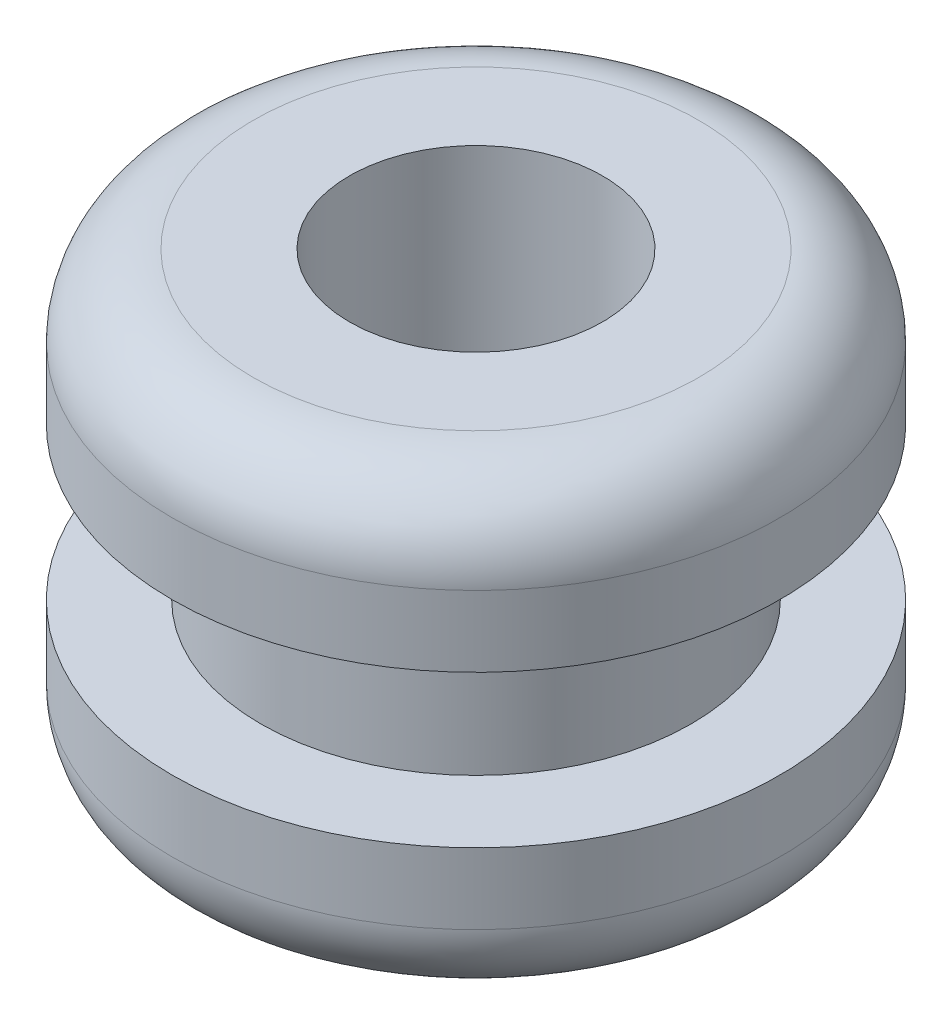
ISO-10303-21;
HEADER;
FILE_DESCRIPTION(('STEP AP214'),'2;1');
FILE_NAME('part.step','',(''),(''),'','','');
FILE_SCHEMA(('AUTOMOTIVE_DESIGN { 1 0 10303 214 1 1 1 1 }'));
ENDSEC;
DATA;
#1=APPLICATION_CONTEXT('core data for automotive mechanical design processes');
#2=APPLICATION_PROTOCOL_DEFINITION('international standard','automotive_design',2000,#1);
#3=PRODUCT_CONTEXT('',#1,'mechanical');
#4=PRODUCT('Part','Part','',(#3));
#5=PRODUCT_RELATED_PRODUCT_CATEGORY('part','',(#4));
#6=PRODUCT_DEFINITION_FORMATION('','',#4);
#7=PRODUCT_DEFINITION_CONTEXT('part definition',#1,'design');
#8=PRODUCT_DEFINITION('design','',#6,#7);
#9=PRODUCT_DEFINITION_SHAPE('','',#8);
#10=(LENGTH_UNIT() NAMED_UNIT(*) SI_UNIT(.MILLI.,.METRE.));
#11=(NAMED_UNIT(*) PLANE_ANGLE_UNIT() SI_UNIT($,.RADIAN.));
#12=(NAMED_UNIT(*) SI_UNIT($,.STERADIAN.) SOLID_ANGLE_UNIT());
#13=UNCERTAINTY_MEASURE_WITH_UNIT(LENGTH_MEASURE(1.E-05),#10,'distance_accuracy_value','');
#14=(GEOMETRIC_REPRESENTATION_CONTEXT(3) GLOBAL_UNCERTAINTY_ASSIGNED_CONTEXT((#13)) GLOBAL_UNIT_ASSIGNED_CONTEXT((#10,
#11,#12)) REPRESENTATION_CONTEXT('',''));
#15=CARTESIAN_POINT('',(0.,0.,0.));
#16=DIRECTION('',(0.,0.,1.));
#17=DIRECTION('',(1.,0.,0.));
#18=AXIS2_PLACEMENT_3D('',#15,#16,#17);
#19=CARTESIAN_POINT('',(0.,7.14375,0.));
#20=DIRECTION('',(0.,-1.,0.));
#21=DIRECTION('',(0.,0.,-1.));
#22=AXIS2_PLACEMENT_3D('',#19,#20,#21);
#23=CYLINDRICAL_SURFACE('',#22,9.525);
#24=CARTESIAN_POINT('',(0.,-4.60375,0.));
#25=DIRECTION('',(0.,1.,0.));
#26=DIRECTION('',(0.,0.,1.));
#27=AXIS2_PLACEMENT_3D('',#24,#25,#26);
#28=CIRCLE('',#27,9.525);
#29=CARTESIAN_POINT('',(0.,-4.60375,9.525));
#30=VERTEX_POINT('',#29);
#31=EDGE_CURVE('E46',#30,#30,#28,.T.);
#32=ORIENTED_EDGE('',*,*,#31,.T.);
#33=EDGE_LOOP('',(#32));
#34=FACE_BOUND('',#33,.T.);
#35=CARTESIAN_POINT('',(0.,-2.38125,0.));
#36=DIRECTION('',(0.,1.,0.));
#37=DIRECTION('',(0.,0.,1.));
#38=AXIS2_PLACEMENT_3D('',#35,#36,#37);
#39=CIRCLE('',#38,9.525);
#40=CARTESIAN_POINT('',(0.,-2.38125,9.525));
#41=VERTEX_POINT('',#40);
#42=EDGE_CURVE('E51',#41,#41,#39,.T.);
#43=ORIENTED_EDGE('',*,*,#42,.F.);
#44=EDGE_LOOP('',(#43));
#45=FACE_BOUND('',#44,.T.);
#46=ADVANCED_FACE('F31',(#34,#45),#23,.T.);
#47=CARTESIAN_POINT('',(0.,-7.14375,0.));
#48=DIRECTION('',(0.,1.,0.));
#49=DIRECTION('',(0.,0.,1.));
#50=AXIS2_PLACEMENT_3D('',#47,#48,#49);
#51=PLANE('',#50);
#52=CARTESIAN_POINT('',(0.,-7.14375,0.));
#53=DIRECTION('',(0.,1.,0.));
#54=DIRECTION('',(0.,0.,1.));
#55=AXIS2_PLACEMENT_3D('',#52,#53,#54);
#56=CIRCLE('',#55,3.96875);
#57=CARTESIAN_POINT('',(0.,-7.14375,3.96875));
#58=VERTEX_POINT('',#57);
#59=EDGE_CURVE('E61',#58,#58,#56,.T.);
#60=ORIENTED_EDGE('',*,*,#59,.T.);
#61=EDGE_LOOP('',(#60));
#62=FACE_BOUND('',#61,.T.);
#63=CARTESIAN_POINT('',(0.,-7.14375,0.));
#64=DIRECTION('',(0.,1.,0.));
#65=DIRECTION('',(0.,0.,1.));
#66=AXIS2_PLACEMENT_3D('',#63,#64,#65);
#67=CIRCLE('',#66,6.985);
#68=CARTESIAN_POINT('',(0.,-7.14375,6.985));
#69=VERTEX_POINT('',#68);
#70=EDGE_CURVE('E42',#69,#69,#67,.F.);
#71=ORIENTED_EDGE('',*,*,#70,.T.);
#72=EDGE_LOOP('',(#71));
#73=FACE_BOUND('',#72,.T.);
#74=ADVANCED_FACE('F70',(#62,#73),#51,.F.);
#75=CARTESIAN_POINT('',(0.,-2.38125,0.));
#76=DIRECTION('',(0.,1.,0.));
#77=DIRECTION('',(0.,0.,1.));
#78=AXIS2_PLACEMENT_3D('',#75,#76,#77);
#79=PLANE('',#78);
#80=CARTESIAN_POINT('',(0.,-2.38125,0.));
#81=DIRECTION('',(0.,1.,0.));
#82=DIRECTION('',(0.,0.,1.));
#83=AXIS2_PLACEMENT_3D('',#80,#81,#82);
#84=CIRCLE('',#83,6.746875);
#85=CARTESIAN_POINT('',(0.,-2.38125,6.746875));
#86=VERTEX_POINT('',#85);
#87=EDGE_CURVE('E55',#86,#86,#84,.T.);
#88=ORIENTED_EDGE('',*,*,#87,.F.);
#89=EDGE_LOOP('',(#88));
#90=FACE_BOUND('',#89,.T.);
#91=ORIENTED_EDGE('',*,*,#42,.T.);
#92=EDGE_LOOP('',(#91));
#93=FACE_BOUND('',#92,.T.);
#94=ADVANCED_FACE('F100',(#90,#93),#79,.T.);
#95=CARTESIAN_POINT('',(0.,2.38125,0.));
#96=DIRECTION('',(0.,1.,0.));
#97=DIRECTION('',(0.,0.,1.));
#98=AXIS2_PLACEMENT_3D('',#95,#96,#97);
#99=PLANE('',#98);
#100=CARTESIAN_POINT('',(0.,2.38125,0.));
#101=DIRECTION('',(0.,1.,0.));
#102=DIRECTION('',(0.,0.,1.));
#103=AXIS2_PLACEMENT_3D('',#100,#101,#102);
#104=CIRCLE('',#103,6.746875);
#105=CARTESIAN_POINT('',(0.,2.38125,6.746875));
#106=VERTEX_POINT('',#105);
#107=EDGE_CURVE('E58',#106,#106,#104,.T.);
#108=ORIENTED_EDGE('',*,*,#107,.T.);
#109=EDGE_LOOP('',(#108));
#110=FACE_BOUND('',#109,.T.);
#111=CARTESIAN_POINT('',(0.,2.38125,0.));
#112=DIRECTION('',(0.,1.,0.));
#113=DIRECTION('',(0.,0.,1.));
#114=AXIS2_PLACEMENT_3D('',#111,#112,#113);
#115=CIRCLE('',#114,9.525);
#116=CARTESIAN_POINT('',(0.,2.38125,9.525));
#117=VERTEX_POINT('',#116);
#118=EDGE_CURVE('E52',#117,#117,#115,.T.);
#119=ORIENTED_EDGE('',*,*,#118,.F.);
#120=EDGE_LOOP('',(#119));
#121=FACE_BOUND('',#120,.T.);
#122=ADVANCED_FACE('F90',(#110,#121),#99,.F.);
#123=CARTESIAN_POINT('',(0.,-2.38125,0.));
#124=DIRECTION('',(0.,1.,0.));
#125=DIRECTION('',(0.,0.,1.));
#126=AXIS2_PLACEMENT_3D('',#123,#124,#125);
#127=CYLINDRICAL_SURFACE('',#126,6.746875);
#128=CARTESIAN_POINT('',(0.,-2.38125,6.746875));
#129=CARTESIAN_POINT('',(0.,-2.331640625,6.746875));
#130=CARTESIAN_POINT('',(0.,-2.28203125,6.746875));
#131=CARTESIAN_POINT('',(0.,-2.1828125,6.746875));
#132=CARTESIAN_POINT('',(0.,-2.133203125,6.746875));
#133=CARTESIAN_POINT('',(0.,-2.033984375,6.746875));
#134=CARTESIAN_POINT('',(0.,-1.984375,6.746875));
#135=CARTESIAN_POINT('',(0.,-1.88515625,6.746875));
#136=CARTESIAN_POINT('',(0.,-1.835546875,6.746875));
#137=CARTESIAN_POINT('',(0.,-1.736328125,6.746875));
#138=CARTESIAN_POINT('',(0.,-1.68671875,6.746875));
#139=CARTESIAN_POINT('',(0.,-1.5875,6.746875));
#140=CARTESIAN_POINT('',(0.,-1.537890625,6.746875));
#141=CARTESIAN_POINT('',(0.,-1.438671875,6.746875));
#142=CARTESIAN_POINT('',(0.,-1.3890625,6.746875));
#143=CARTESIAN_POINT('',(0.,-1.28984375,6.746875));
#144=CARTESIAN_POINT('',(0.,-1.240234375,6.746875));
#145=CARTESIAN_POINT('',(0.,-1.141015625,6.746875));
#146=CARTESIAN_POINT('',(0.,-1.09140625,6.746875));
#147=CARTESIAN_POINT('',(0.,-0.9921875,6.746875));
#148=CARTESIAN_POINT('',(0.,-0.942578125,6.746875));
#149=CARTESIAN_POINT('',(0.,-0.843359375,6.746875));
#150=CARTESIAN_POINT('',(0.,-0.79375,6.746875));
#151=CARTESIAN_POINT('',(0.,-0.69453125,6.746875));
#152=CARTESIAN_POINT('',(0.,-0.644921875,6.746875));
#153=CARTESIAN_POINT('',(0.,-0.545703125,6.746875));
#154=CARTESIAN_POINT('',(0.,-0.49609375,6.746875));
#155=CARTESIAN_POINT('',(0.,-0.396875,6.746875));
#156=CARTESIAN_POINT('',(0.,-0.347265625,6.746875));
#157=CARTESIAN_POINT('',(0.,-0.248046875000001,6.746875));
#158=CARTESIAN_POINT('',(0.,-0.198437500000001,6.746875));
#159=CARTESIAN_POINT('',(0.,-0.0992187500000005,6.746875));
#160=CARTESIAN_POINT('',(0.,-0.0496093750000005,6.746875));
#161=CARTESIAN_POINT('',(0.,0.0496093749999996,6.746875));
#162=CARTESIAN_POINT('',(0.,0.0992187499999996,6.746875));
#163=CARTESIAN_POINT('',(0.,0.1984375,6.746875));
#164=CARTESIAN_POINT('',(0.,0.248046875,6.746875));
#165=CARTESIAN_POINT('',(0.,0.347265625,6.746875));
#166=CARTESIAN_POINT('',(0.,0.396875,6.746875));
#167=CARTESIAN_POINT('',(0.,0.49609375,6.746875));
#168=CARTESIAN_POINT('',(0.,0.545703125,6.746875));
#169=CARTESIAN_POINT('',(0.,0.644921875,6.746875));
#170=CARTESIAN_POINT('',(0.,0.69453125,6.746875));
#171=CARTESIAN_POINT('',(0.,0.79375,6.746875));
#172=CARTESIAN_POINT('',(0.,0.843359375,6.746875));
#173=CARTESIAN_POINT('',(0.,0.942578125,6.746875));
#174=CARTESIAN_POINT('',(0.,0.9921875,6.746875));
#175=CARTESIAN_POINT('',(0.,1.09140625,6.746875));
#176=CARTESIAN_POINT('',(0.,1.141015625,6.746875));
#177=CARTESIAN_POINT('',(0.,1.240234375,6.746875));
#178=CARTESIAN_POINT('',(0.,1.28984375,6.746875));
#179=CARTESIAN_POINT('',(0.,1.3890625,6.746875));
#180=CARTESIAN_POINT('',(0.,1.438671875,6.746875));
#181=CARTESIAN_POINT('',(0.,1.537890625,6.746875));
#182=CARTESIAN_POINT('',(0.,1.5875,6.746875));
#183=CARTESIAN_POINT('',(0.,1.68671875,6.746875));
#184=CARTESIAN_POINT('',(0.,1.736328125,6.746875));
#185=CARTESIAN_POINT('',(0.,1.835546875,6.746875));
#186=CARTESIAN_POINT('',(0.,1.88515625,6.746875));
#187=CARTESIAN_POINT('',(0.,1.984375,6.746875));
#188=CARTESIAN_POINT('',(0.,2.033984375,6.746875));
#189=CARTESIAN_POINT('',(0.,2.133203125,6.746875));
#190=CARTESIAN_POINT('',(0.,2.1828125,6.746875));
#191=CARTESIAN_POINT('',(0.,2.28203125,6.746875));
#192=CARTESIAN_POINT('',(0.,2.331640625,6.746875));
#193=CARTESIAN_POINT('',(0.,2.38125,6.746875));
#194=B_SPLINE_CURVE_WITH_KNOTS('',3,(#128,#129,#130,#131,#132,#133,#134,#135,#136,#137,#138,
#139,#140,#141,#142,#143,#144,#145,#146,#147,#148,#149,#150,#151,#152,#153,#154,#155,#156,#157,
#158,#159,#160,#161,#162,#163,#164,#165,#166,#167,#168,#169,#170,#171,#172,#173,#174,#175,#176,
#177,#178,#179,#180,#181,#182,#183,#184,#185,#186,#187,#188,#189,#190,#191,#192,#193),
.UNSPECIFIED.,.F.,.F.,(4,2,2,2,2,2,2,2,2,2,2,2,2,2,2,2,2,2,2,2,2,2,2,2,2,2,2,2,2,2,2,2,4),(0.,
0.148828125,0.29765625,0.446484375,0.5953125,0.744140625,0.89296875,1.041796875,1.190625,
1.339453125,1.48828125,1.637109375,1.7859375,1.934765625,2.08359375,2.232421875,2.38125,
2.530078125,2.67890625,2.827734375,2.9765625,3.125390625,3.27421875,3.423046875,3.571875,
3.720703125,3.86953125,4.018359375,4.1671875,4.316015625,4.46484375,4.613671875,4.7625),.UNSPECIFIED.);
#195=EDGE_CURVE('BSEAM82',#86,#106,#194,.T.);
#196=ORIENTED_EDGE('',*,*,#87,.T.);
#197=ORIENTED_EDGE('',*,*,#107,.F.);
#198=ORIENTED_EDGE('',*,*,#195,.T.);
#199=ORIENTED_EDGE('',*,*,#195,.F.);
#200=EDGE_LOOP('',(#196,#198,#197,#199));
#201=FACE_BOUND('',#200,.T.);
#202=ADVANCED_FACE('F82',(#201),#127,.T.);
#203=CARTESIAN_POINT('',(0.,7.14375,0.));
#204=DIRECTION('',(0.,1.,0.));
#205=DIRECTION('',(0.,0.,1.));
#206=AXIS2_PLACEMENT_3D('',#203,#204,#205);
#207=PLANE('',#206);
#208=CARTESIAN_POINT('',(0.,7.14375,0.));
#209=DIRECTION('',(0.,1.,0.));
#210=DIRECTION('',(0.,0.,1.));
#211=AXIS2_PLACEMENT_3D('',#208,#209,#210);
#212=CIRCLE('',#211,3.96875);
#213=CARTESIAN_POINT('',(0.,7.14375,3.96875));
#214=VERTEX_POINT('',#213);
#215=EDGE_CURVE('E64',#214,#214,#212,.T.);
#216=ORIENTED_EDGE('',*,*,#215,.F.);
#217=EDGE_LOOP('',(#216));
#218=FACE_BOUND('',#217,.T.);
#219=CARTESIAN_POINT('',(0.,7.14375,0.));
#220=DIRECTION('',(0.,1.,0.));
#221=DIRECTION('',(0.,0.,1.));
#222=AXIS2_PLACEMENT_3D('',#219,#220,#221);
#223=CIRCLE('',#222,6.985);
#224=CARTESIAN_POINT('',(0.,7.14375,6.985));
#225=VERTEX_POINT('',#224);
#226=EDGE_CURVE('E38',#225,#225,#223,.T.);
#227=ORIENTED_EDGE('',*,*,#226,.T.);
#228=EDGE_LOOP('',(#227));
#229=FACE_BOUND('',#228,.T.);
#230=ADVANCED_FACE('F79',(#218,#229),#207,.T.);
#231=CARTESIAN_POINT('',(0.,4.60375,0.));
#232=DIRECTION('',(0.,1.,0.));
#233=DIRECTION('',(0.,0.,1.));
#234=AXIS2_PLACEMENT_3D('',#231,#232,#233);
#235=CIRCLE('',#234,9.525);
#236=CARTESIAN_POINT('',(0.,4.60375,9.525));
#237=VERTEX_POINT('',#236);
#238=EDGE_CURVE('E10',#237,#237,#235,.F.);
#239=ORIENTED_EDGE('',*,*,#238,.T.);
#240=EDGE_LOOP('',(#239));
#241=FACE_BOUND('',#240,.T.);
#242=ORIENTED_EDGE('',*,*,#118,.T.);
#243=EDGE_LOOP('',(#242));
#244=FACE_BOUND('',#243,.T.);
#245=ADVANCED_FACE('F81',(#241,#244),#23,.T.);
#246=CARTESIAN_POINT('',(0.,-4.60375,0.));
#247=DIRECTION('',(0.,1.,0.));
#248=DIRECTION('',(0.,0.,1.));
#249=AXIS2_PLACEMENT_3D('',#246,#247,#248);
#250=TOROIDAL_SURFACE('',#249,6.985,2.54);
#251=ORIENTED_EDGE('',*,*,#70,.F.);
#252=EDGE_LOOP('',(#251));
#253=FACE_BOUND('',#252,.T.);
#254=ORIENTED_EDGE('',*,*,#31,.F.);
#255=EDGE_LOOP('',(#254));
#256=FACE_BOUND('',#255,.T.);
#257=ADVANCED_FACE('F88',(#253,#256),#250,.T.);
#258=CARTESIAN_POINT('',(0.,4.60375,0.));
#259=DIRECTION('',(0.,1.,0.));
#260=DIRECTION('',(0.,0.,1.));
#261=AXIS2_PLACEMENT_3D('',#258,#259,#260);
#262=TOROIDAL_SURFACE('',#261,6.985,2.54);
#263=ORIENTED_EDGE('',*,*,#238,.F.);
#264=EDGE_LOOP('',(#263));
#265=FACE_BOUND('',#264,.T.);
#266=ORIENTED_EDGE('',*,*,#226,.F.);
#267=EDGE_LOOP('',(#266));
#268=FACE_BOUND('',#267,.T.);
#269=ADVANCED_FACE('F33',(#265,#268),#262,.T.);
#270=CARTESIAN_POINT('',(0.,-7.14375,0.));
#271=DIRECTION('',(0.,1.,0.));
#272=DIRECTION('',(0.,0.,1.));
#273=AXIS2_PLACEMENT_3D('',#270,#271,#272);
#274=CYLINDRICAL_SURFACE('',#273,3.96875);
#275=ORIENTED_EDGE('',*,*,#59,.F.);
#276=EDGE_LOOP('',(#275));
#277=FACE_BOUND('',#276,.T.);
#278=ORIENTED_EDGE('',*,*,#215,.T.);
#279=EDGE_LOOP('',(#278));
#280=FACE_BOUND('',#279,.T.);
#281=ADVANCED_FACE('F73',(#277,#280),#274,.F.);
#282=CLOSED_SHELL('',(#46,#74,#94,#122,#202,#230,#245,#257,#269,#281));
#283=MANIFOLD_SOLID_BREP('B2',#282);
#284=ADVANCED_BREP_SHAPE_REPRESENTATION('',(#18,#283),#14);
#285=SHAPE_DEFINITION_REPRESENTATION(#9,#284);
ENDSEC;
END-ISO-10303-21;
